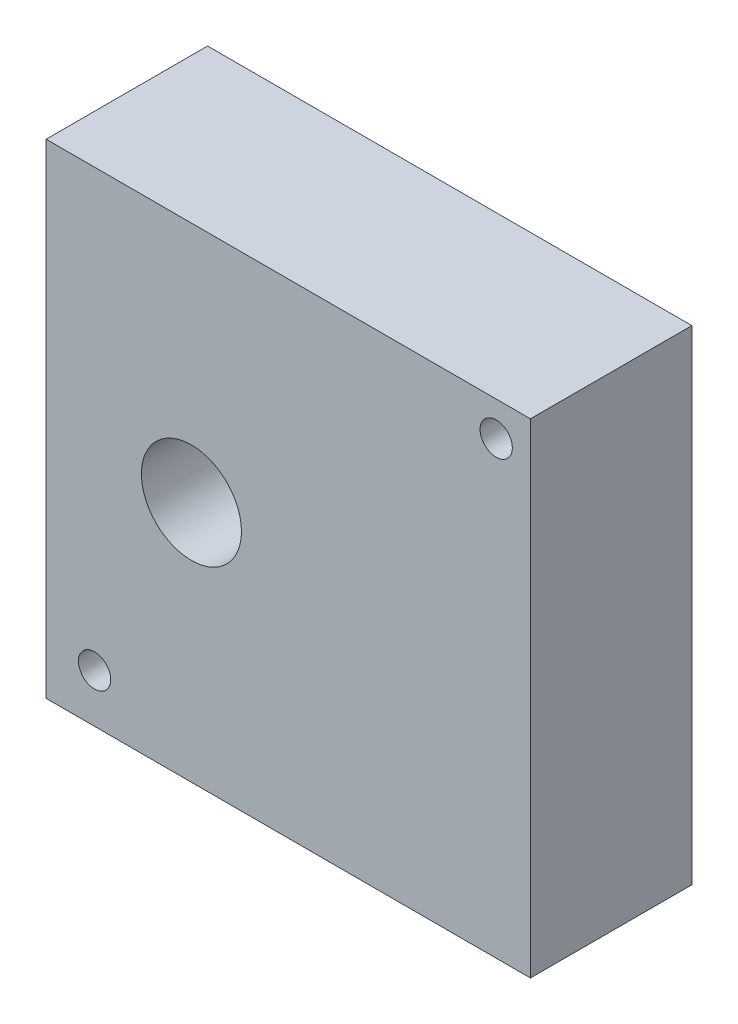
ISO-10303-21;
HEADER;
FILE_DESCRIPTION(('STEP AP214'),'2;1');
FILE_NAME('part.step','',(''),(''),'','','');
FILE_SCHEMA(('AUTOMOTIVE_DESIGN { 1 0 10303 214 1 1 1 1 }'));
ENDSEC;
DATA;
#1=APPLICATION_CONTEXT('core data for automotive mechanical design processes');
#2=APPLICATION_PROTOCOL_DEFINITION('international standard','automotive_design',2000,#1);
#3=PRODUCT_CONTEXT('',#1,'mechanical');
#4=PRODUCT('Part','Part','',(#3));
#5=PRODUCT_RELATED_PRODUCT_CATEGORY('part','',(#4));
#6=PRODUCT_DEFINITION_FORMATION('','',#4);
#7=PRODUCT_DEFINITION_CONTEXT('part definition',#1,'design');
#8=PRODUCT_DEFINITION('design','',#6,#7);
#9=PRODUCT_DEFINITION_SHAPE('','',#8);
#10=(LENGTH_UNIT() NAMED_UNIT(*) SI_UNIT(.MILLI.,.METRE.));
#11=(NAMED_UNIT(*) PLANE_ANGLE_UNIT() SI_UNIT($,.RADIAN.));
#12=(NAMED_UNIT(*) SI_UNIT($,.STERADIAN.) SOLID_ANGLE_UNIT());
#13=UNCERTAINTY_MEASURE_WITH_UNIT(LENGTH_MEASURE(1.E-05),#10,'distance_accuracy_value','');
#14=(GEOMETRIC_REPRESENTATION_CONTEXT(3) GLOBAL_UNCERTAINTY_ASSIGNED_CONTEXT((#13)) GLOBAL_UNIT_ASSIGNED_CONTEXT((#10,
#11,#12)) REPRESENTATION_CONTEXT('',''));
#15=CARTESIAN_POINT('',(0.,0.,0.));
#16=DIRECTION('',(0.,0.,1.));
#17=DIRECTION('',(1.,0.,0.));
#18=AXIS2_PLACEMENT_3D('',#15,#16,#17);
#19=CARTESIAN_POINT('',(-15.,15.,30.));
#20=DIRECTION('',(1.,0.,0.));
#21=DIRECTION('',(0.,0.,-1.));
#22=AXIS2_PLACEMENT_3D('',#19,#20,#21);
#23=PLANE('',#22);
#24=DIRECTION('',(0.,-1.,0.));
#25=VECTOR('',#24,1.);
#26=CARTESIAN_POINT('',(-15.,15.,20.));
#27=LINE('',#26,#25);
#28=CARTESIAN_POINT('',(-15.,15.,20.));
#29=VERTEX_POINT('',#28);
#30=CARTESIAN_POINT('',(-15.,-15.,20.));
#31=VERTEX_POINT('',#30);
#32=EDGE_CURVE('E151',#29,#31,#27,.T.);
#33=ORIENTED_EDGE('',*,*,#32,.T.);
#34=DIRECTION('',(0.,0.,-1.));
#35=VECTOR('',#34,1.);
#36=CARTESIAN_POINT('',(-15.,-15.,30.));
#37=LINE('',#36,#35);
#38=CARTESIAN_POINT('',(-15.,-15.,30.));
#39=VERTEX_POINT('',#38);
#40=EDGE_CURVE('E12',#39,#31,#37,.T.);
#41=ORIENTED_EDGE('',*,*,#40,.F.);
#42=DIRECTION('',(0.,-1.,0.));
#43=VECTOR('',#42,1.);
#44=CARTESIAN_POINT('',(-15.,15.,30.));
#45=LINE('',#44,#43);
#46=CARTESIAN_POINT('',(-15.,15.,30.));
#47=VERTEX_POINT('',#46);
#48=EDGE_CURVE('E138',#47,#39,#45,.T.);
#49=ORIENTED_EDGE('',*,*,#48,.F.);
#50=DIRECTION('',(0.,0.,-1.));
#51=VECTOR('',#50,1.);
#52=CARTESIAN_POINT('',(-15.,15.,30.));
#53=LINE('',#52,#51);
#54=EDGE_CURVE('E147',#47,#29,#53,.T.);
#55=ORIENTED_EDGE('',*,*,#54,.T.);
#56=EDGE_LOOP('',(#33,#41,#49,#55));
#57=FACE_BOUND('',#56,.T.);
#58=ADVANCED_FACE('F85',(#57),#23,.F.);
#59=CARTESIAN_POINT('',(-15.,-15.,30.));
#60=DIRECTION('',(0.,1.,0.));
#61=DIRECTION('',(0.,0.,1.));
#62=AXIS2_PLACEMENT_3D('',#59,#60,#61);
#63=PLANE('',#62);
#64=DIRECTION('',(1.,0.,0.));
#65=VECTOR('',#64,1.);
#66=CARTESIAN_POINT('',(-15.,-15.,20.));
#67=LINE('',#66,#65);
#68=CARTESIAN_POINT('',(15.,-15.,20.));
#69=VERTEX_POINT('',#68);
#70=EDGE_CURVE('E142',#31,#69,#67,.T.);
#71=ORIENTED_EDGE('',*,*,#70,.T.);
#72=DIRECTION('',(0.,0.,-1.));
#73=VECTOR('',#72,1.);
#74=CARTESIAN_POINT('',(15.,-15.,30.));
#75=LINE('',#74,#73);
#76=CARTESIAN_POINT('',(15.,-15.,30.));
#77=VERTEX_POINT('',#76);
#78=EDGE_CURVE('E94',#77,#69,#75,.T.);
#79=ORIENTED_EDGE('',*,*,#78,.F.);
#80=DIRECTION('',(1.,0.,0.));
#81=VECTOR('',#80,1.);
#82=CARTESIAN_POINT('',(-15.,-15.,30.));
#83=LINE('',#82,#81);
#84=EDGE_CURVE('E133',#39,#77,#83,.T.);
#85=ORIENTED_EDGE('',*,*,#84,.F.);
#86=ORIENTED_EDGE('',*,*,#40,.T.);
#87=EDGE_LOOP('',(#71,#79,#85,#86));
#88=FACE_BOUND('',#87,.T.);
#89=ADVANCED_FACE('F141',(#88),#63,.F.);
#90=CARTESIAN_POINT('',(15.,15.,30.));
#91=DIRECTION('',(-1.,0.,0.));
#92=DIRECTION('',(0.,0.,1.));
#93=AXIS2_PLACEMENT_3D('',#90,#91,#92);
#94=PLANE('',#93);
#95=DIRECTION('',(0.,1.,0.));
#96=VECTOR('',#95,1.);
#97=CARTESIAN_POINT('',(15.,15.,20.));
#98=LINE('',#97,#96);
#99=CARTESIAN_POINT('',(15.,15.,20.));
#100=VERTEX_POINT('',#99);
#101=EDGE_CURVE('E120',#69,#100,#98,.T.);
#102=ORIENTED_EDGE('',*,*,#101,.T.);
#103=DIRECTION('',(0.,0.,-1.));
#104=VECTOR('',#103,1.);
#105=CARTESIAN_POINT('',(15.,15.,30.));
#106=LINE('',#105,#104);
#107=CARTESIAN_POINT('',(15.,15.,30.));
#108=VERTEX_POINT('',#107);
#109=EDGE_CURVE('E143',#108,#100,#106,.T.);
#110=ORIENTED_EDGE('',*,*,#109,.F.);
#111=DIRECTION('',(0.,1.,0.));
#112=VECTOR('',#111,1.);
#113=CARTESIAN_POINT('',(15.,15.,30.));
#114=LINE('',#113,#112);
#115=EDGE_CURVE('E136',#77,#108,#114,.T.);
#116=ORIENTED_EDGE('',*,*,#115,.F.);
#117=ORIENTED_EDGE('',*,*,#78,.T.);
#118=EDGE_LOOP('',(#102,#110,#116,#117));
#119=FACE_BOUND('',#118,.T.);
#120=ADVANCED_FACE('F145',(#119),#94,.F.);
#121=CARTESIAN_POINT('',(-15.,15.,30.));
#122=DIRECTION('',(0.,-1.,0.));
#123=DIRECTION('',(0.,0.,-1.));
#124=AXIS2_PLACEMENT_3D('',#121,#122,#123);
#125=PLANE('',#124);
#126=DIRECTION('',(-1.,0.,0.));
#127=VECTOR('',#126,1.);
#128=CARTESIAN_POINT('',(-15.,15.,20.));
#129=LINE('',#128,#127);
#130=EDGE_CURVE('E126',#100,#29,#129,.T.);
#131=ORIENTED_EDGE('',*,*,#130,.T.);
#132=ORIENTED_EDGE('',*,*,#54,.F.);
#133=DIRECTION('',(-1.,0.,0.));
#134=VECTOR('',#133,1.);
#135=CARTESIAN_POINT('',(-15.,15.,30.));
#136=LINE('',#135,#134);
#137=EDGE_CURVE('E103',#108,#47,#136,.T.);
#138=ORIENTED_EDGE('',*,*,#137,.F.);
#139=ORIENTED_EDGE('',*,*,#109,.T.);
#140=EDGE_LOOP('',(#131,#132,#138,#139));
#141=FACE_BOUND('',#140,.T.);
#142=ADVANCED_FACE('F183',(#141),#125,.F.);
#143=CARTESIAN_POINT('',(0.,0.,30.));
#144=DIRECTION('',(0.,0.,1.));
#145=DIRECTION('',(1.,0.,0.));
#146=AXIS2_PLACEMENT_3D('',#143,#144,#145);
#147=PLANE('',#146);
#148=CARTESIAN_POINT('',(-12.,-12.,30.));
#149=DIRECTION('',(0.,0.,1.));
#150=DIRECTION('',(1.,0.,0.));
#151=AXIS2_PLACEMENT_3D('',#148,#149,#150);
#152=CIRCLE('',#151,1.);
#153=CARTESIAN_POINT('',(-11.,-12.,30.));
#154=VERTEX_POINT('',#153);
#155=EDGE_CURVE('E161',#154,#154,#152,.T.);
#156=ORIENTED_EDGE('',*,*,#155,.F.);
#157=EDGE_LOOP('',(#156));
#158=FACE_BOUND('',#157,.T.);
#159=CARTESIAN_POINT('',(12.8786796564404,12.8786796564404,30.));
#160=DIRECTION('',(0.,0.,1.));
#161=DIRECTION('',(1.,0.,0.));
#162=AXIS2_PLACEMENT_3D('',#159,#160,#161);
#163=CIRCLE('',#162,1.);
#164=CARTESIAN_POINT('',(13.8786796564404,12.8786796564404,30.));
#165=VERTEX_POINT('',#164);
#166=EDGE_CURVE('E167',#165,#165,#163,.T.);
#167=ORIENTED_EDGE('',*,*,#166,.F.);
#168=EDGE_LOOP('',(#167));
#169=FACE_BOUND('',#168,.T.);
#170=CARTESIAN_POINT('',(-6.,0.,30.));
#171=DIRECTION('',(0.,0.,1.));
#172=DIRECTION('',(1.,0.,0.));
#173=AXIS2_PLACEMENT_3D('',#170,#171,#172);
#174=CIRCLE('',#173,3.1);
#175=CARTESIAN_POINT('',(-2.9,0.,30.));
#176=VERTEX_POINT('',#175);
#177=EDGE_CURVE('E165',#176,#176,#174,.T.);
#178=ORIENTED_EDGE('',*,*,#177,.F.);
#179=EDGE_LOOP('',(#178));
#180=FACE_BOUND('',#179,.T.);
#181=ORIENTED_EDGE('',*,*,#48,.T.);
#182=ORIENTED_EDGE('',*,*,#84,.T.);
#183=ORIENTED_EDGE('',*,*,#115,.T.);
#184=ORIENTED_EDGE('',*,*,#137,.T.);
#185=EDGE_LOOP('',(#181,#182,#183,#184));
#186=FACE_BOUND('',#185,.T.);
#187=ADVANCED_FACE('F134',(#158,#169,#180,#186),#147,.T.);
#188=CARTESIAN_POINT('',(0.,0.,20.));
#189=DIRECTION('',(0.,0.,1.));
#190=DIRECTION('',(1.,0.,0.));
#191=AXIS2_PLACEMENT_3D('',#188,#189,#190);
#192=PLANE('',#191);
#193=CARTESIAN_POINT('',(-12.,-12.,20.));
#194=DIRECTION('',(0.,0.,1.));
#195=DIRECTION('',(1.,0.,0.));
#196=AXIS2_PLACEMENT_3D('',#193,#194,#195);
#197=CIRCLE('',#196,1.);
#198=CARTESIAN_POINT('',(-11.,-12.,20.));
#199=VERTEX_POINT('',#198);
#200=EDGE_CURVE('E88',#199,#199,#197,.T.);
#201=ORIENTED_EDGE('',*,*,#200,.T.);
#202=EDGE_LOOP('',(#201));
#203=FACE_BOUND('',#202,.T.);
#204=CARTESIAN_POINT('',(12.8786796564404,12.8786796564404,20.));
#205=DIRECTION('',(0.,0.,1.));
#206=DIRECTION('',(1.,0.,0.));
#207=AXIS2_PLACEMENT_3D('',#204,#205,#206);
#208=CIRCLE('',#207,1.);
#209=CARTESIAN_POINT('',(13.8786796564404,12.8786796564404,20.));
#210=VERTEX_POINT('',#209);
#211=EDGE_CURVE('E159',#210,#210,#208,.T.);
#212=ORIENTED_EDGE('',*,*,#211,.T.);
#213=EDGE_LOOP('',(#212));
#214=FACE_BOUND('',#213,.T.);
#215=CARTESIAN_POINT('',(-6.,0.,20.));
#216=DIRECTION('',(0.,0.,1.));
#217=DIRECTION('',(1.,0.,0.));
#218=AXIS2_PLACEMENT_3D('',#215,#216,#217);
#219=CIRCLE('',#218,3.1);
#220=CARTESIAN_POINT('',(-2.9,0.,20.));
#221=VERTEX_POINT('',#220);
#222=EDGE_CURVE('E154',#221,#221,#219,.T.);
#223=ORIENTED_EDGE('',*,*,#222,.T.);
#224=EDGE_LOOP('',(#223));
#225=FACE_BOUND('',#224,.T.);
#226=ORIENTED_EDGE('',*,*,#32,.F.);
#227=ORIENTED_EDGE('',*,*,#130,.F.);
#228=ORIENTED_EDGE('',*,*,#101,.F.);
#229=ORIENTED_EDGE('',*,*,#70,.F.);
#230=EDGE_LOOP('',(#226,#227,#228,#229));
#231=FACE_BOUND('',#230,.T.);
#232=ADVANCED_FACE('F182',(#203,#214,#225,#231),#192,.F.);
#233=CARTESIAN_POINT('',(-6.,0.,20.));
#234=DIRECTION('',(0.,0.,1.));
#235=DIRECTION('',(1.,0.,0.));
#236=AXIS2_PLACEMENT_3D('',#233,#234,#235);
#237=CYLINDRICAL_SURFACE('',#236,3.1);
#238=ORIENTED_EDGE('',*,*,#222,.F.);
#239=EDGE_LOOP('',(#238));
#240=FACE_BOUND('',#239,.T.);
#241=ORIENTED_EDGE('',*,*,#177,.T.);
#242=EDGE_LOOP('',(#241));
#243=FACE_BOUND('',#242,.T.);
#244=ADVANCED_FACE('F179',(#240,#243),#237,.F.);
#245=CARTESIAN_POINT('',(12.8786796564404,12.8786796564404,-2.82842712474619));
#246=DIRECTION('',(0.,0.,1.));
#247=DIRECTION('',(1.,0.,0.));
#248=AXIS2_PLACEMENT_3D('',#245,#246,#247);
#249=CYLINDRICAL_SURFACE('',#248,1.);
#250=ORIENTED_EDGE('',*,*,#166,.T.);
#251=EDGE_LOOP('',(#250));
#252=FACE_BOUND('',#251,.T.);
#253=ORIENTED_EDGE('',*,*,#211,.F.);
#254=EDGE_LOOP('',(#253));
#255=FACE_BOUND('',#254,.T.);
#256=ADVANCED_FACE('F221',(#252,#255),#249,.F.);
#257=CARTESIAN_POINT('',(-12.,-12.,-2.82842712474619));
#258=DIRECTION('',(0.,0.,1.));
#259=DIRECTION('',(1.,0.,0.));
#260=AXIS2_PLACEMENT_3D('',#257,#258,#259);
#261=CYLINDRICAL_SURFACE('',#260,1.);
#262=ORIENTED_EDGE('',*,*,#155,.T.);
#263=EDGE_LOOP('',(#262));
#264=FACE_BOUND('',#263,.T.);
#265=ORIENTED_EDGE('',*,*,#200,.F.);
#266=EDGE_LOOP('',(#265));
#267=FACE_BOUND('',#266,.T.);
#268=ADVANCED_FACE('F240',(#264,#267),#261,.F.);
#269=CLOSED_SHELL('',(#58,#89,#120,#142,#187,#232,#244,#256,#268));
#270=MANIFOLD_SOLID_BREP('B2',#269);
#271=ADVANCED_BREP_SHAPE_REPRESENTATION('',(#18,#270),#14);
#272=SHAPE_DEFINITION_REPRESENTATION(#9,#271);
ENDSEC;
END-ISO-10303-21;
